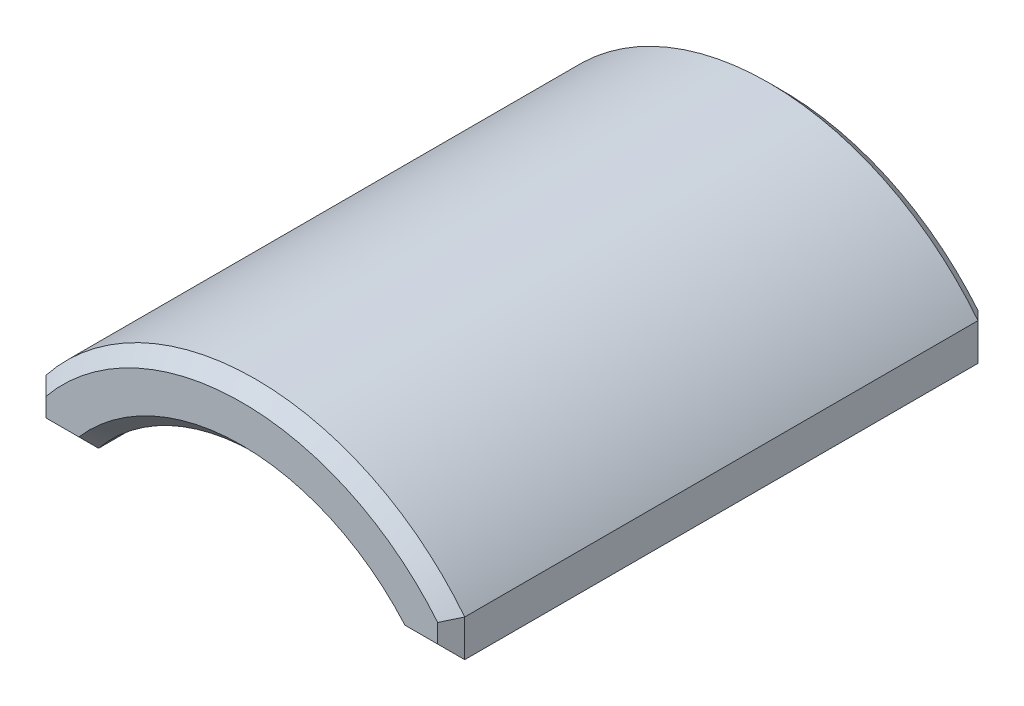
ISO-10303-21;
HEADER;
FILE_DESCRIPTION(('STEP AP214'),'2;1');
FILE_NAME('part.step','',(''),(''),'','','');
FILE_SCHEMA(('AUTOMOTIVE_DESIGN { 1 0 10303 214 1 1 1 1 }'));
ENDSEC;
DATA;
#1=APPLICATION_CONTEXT('core data for automotive mechanical design processes');
#2=APPLICATION_PROTOCOL_DEFINITION('international standard','automotive_design',2000,#1);
#3=PRODUCT_CONTEXT('',#1,'mechanical');
#4=PRODUCT('Part','Part','',(#3));
#5=PRODUCT_RELATED_PRODUCT_CATEGORY('part','',(#4));
#6=PRODUCT_DEFINITION_FORMATION('','',#4);
#7=PRODUCT_DEFINITION_CONTEXT('part definition',#1,'design');
#8=PRODUCT_DEFINITION('design','',#6,#7);
#9=PRODUCT_DEFINITION_SHAPE('','',#8);
#10=(LENGTH_UNIT() NAMED_UNIT(*) SI_UNIT(.MILLI.,.METRE.));
#11=(NAMED_UNIT(*) PLANE_ANGLE_UNIT() SI_UNIT($,.RADIAN.));
#12=(NAMED_UNIT(*) SI_UNIT($,.STERADIAN.) SOLID_ANGLE_UNIT());
#13=UNCERTAINTY_MEASURE_WITH_UNIT(LENGTH_MEASURE(1.E-05),#10,'distance_accuracy_value','');
#14=(GEOMETRIC_REPRESENTATION_CONTEXT(3) GLOBAL_UNCERTAINTY_ASSIGNED_CONTEXT((#13)) GLOBAL_UNIT_ASSIGNED_CONTEXT((#10,
#11,#12)) REPRESENTATION_CONTEXT('',''));
#15=CARTESIAN_POINT('',(0.,0.,0.));
#16=DIRECTION('',(0.,0.,1.));
#17=DIRECTION('',(1.,0.,0.));
#18=AXIS2_PLACEMENT_3D('',#15,#16,#17);
#19=CARTESIAN_POINT('',(0.,0.,40.));
#20=DIRECTION('',(0.,0.,-1.));
#21=DIRECTION('',(-0.999999999999999,0.,0.));
#22=AXIS2_PLACEMENT_3D('',#19,#20,#21);
#23=CYLINDRICAL_SURFACE('',#22,19.75);
#24=DIRECTION('',(0.,0.,-1.));
#25=VECTOR('',#24,1.);
#26=CARTESIAN_POINT('',(15.5,12.2397916648935,40.0000000000001));
#27=LINE('',#26,#25);
#28=CARTESIAN_POINT('',(15.5,12.2397916648935,39.0000000000001));
#29=VERTEX_POINT('',#28);
#30=CARTESIAN_POINT('',(15.5,12.2397916648936,1.00000000000008));
#31=VERTEX_POINT('',#30);
#32=EDGE_CURVE('E323',#29,#31,#27,.T.);
#33=ORIENTED_EDGE('',*,*,#32,.T.);
#34=CARTESIAN_POINT('',(0.,0.,1.));
#35=DIRECTION('',(0.,0.,1.));
#36=DIRECTION('',(0.999999999999999,0.,0.));
#37=AXIS2_PLACEMENT_3D('',#34,#35,#36);
#38=CIRCLE('',#37,19.75);
#39=CARTESIAN_POINT('',(-15.5,12.2397916648937,1.));
#40=VERTEX_POINT('',#39);
#41=EDGE_CURVE('E191',#31,#40,#38,.T.);
#42=ORIENTED_EDGE('',*,*,#41,.T.);
#43=DIRECTION('',(0.,0.,-1.));
#44=VECTOR('',#43,1.);
#45=CARTESIAN_POINT('',(-15.5,12.2397916648936,40.));
#46=LINE('',#45,#44);
#47=CARTESIAN_POINT('',(-15.5,12.2397916648936,39.));
#48=VERTEX_POINT('',#47);
#49=EDGE_CURVE('E142',#48,#40,#46,.T.);
#50=ORIENTED_EDGE('',*,*,#49,.F.);
#51=CARTESIAN_POINT('',(0.,0.,39.));
#52=DIRECTION('',(0.,0.,1.));
#53=DIRECTION('',(0.999999999999999,0.,0.));
#54=AXIS2_PLACEMENT_3D('',#51,#52,#53);
#55=CIRCLE('',#54,19.75);
#56=EDGE_CURVE('E189',#48,#29,#55,.F.);
#57=ORIENTED_EDGE('',*,*,#56,.T.);
#58=EDGE_LOOP('',(#33,#42,#50,#57));
#59=FACE_BOUND('',#58,.T.);
#60=ADVANCED_FACE('F33',(#59),#23,.T.);
#61=CARTESIAN_POINT('',(-15.5,12.2397916648936,40.));
#62=DIRECTION('',(0.999999999999999,0.,0.));
#63=DIRECTION('',(0.,0.,-1.));
#64=AXIS2_PLACEMENT_3D('',#61,#62,#63);
#65=PLANE('',#64);
#66=ORIENTED_EDGE('',*,*,#49,.T.);
#67=DIRECTION('',(0.,-1.,0.));
#68=VECTOR('',#67,1.);
#69=CARTESIAN_POINT('',(-15.5,12.2397916648937,1.));
#70=LINE('',#69,#68);
#71=CARTESIAN_POINT('',(-15.5,9.50000000000003,0.999999999999918));
#72=VERTEX_POINT('',#71);
#73=EDGE_CURVE('E141',#40,#72,#70,.T.);
#74=ORIENTED_EDGE('',*,*,#73,.T.);
#75=DIRECTION('',(0.,0.,-1.));
#76=VECTOR('',#75,1.);
#77=CARTESIAN_POINT('',(-15.5,9.49999999999994,40.));
#78=LINE('',#77,#76);
#79=CARTESIAN_POINT('',(-15.5,9.49999999999996,39.));
#80=VERTEX_POINT('',#79);
#81=EDGE_CURVE('E123',#80,#72,#78,.T.);
#82=ORIENTED_EDGE('',*,*,#81,.F.);
#83=DIRECTION('',(0.,1.,0.));
#84=VECTOR('',#83,1.);
#85=CARTESIAN_POINT('',(-15.5,12.2397916648936,39.));
#86=LINE('',#85,#84);
#87=EDGE_CURVE('E138',#80,#48,#86,.T.);
#88=ORIENTED_EDGE('',*,*,#87,.T.);
#89=EDGE_LOOP('',(#66,#74,#82,#88));
#90=FACE_BOUND('',#89,.T.);
#91=ADVANCED_FACE('F136',(#90),#65,.F.);
#92=CARTESIAN_POINT('',(-15.5,9.49999999999994,40.));
#93=DIRECTION('',(0.,1.,0.));
#94=DIRECTION('',(0.,0.,1.));
#95=AXIS2_PLACEMENT_3D('',#92,#93,#94);
#96=PLANE('',#95);
#97=ORIENTED_EDGE('',*,*,#81,.T.);
#98=DIRECTION('',(0.999999999999999,0.,0.));
#99=VECTOR('',#98,1.);
#100=CARTESIAN_POINT('',(-15.5,9.50000000000003,0.999999999999918));
#101=LINE('',#100,#99);
#102=CARTESIAN_POINT('',(-11.6081867662439,9.50000000000001,0.999999999999918));
#103=VERTEX_POINT('',#102);
#104=EDGE_CURVE('E130',#72,#103,#101,.T.);
#105=ORIENTED_EDGE('',*,*,#104,.T.);
#106=DIRECTION('',(0.,0.,-1.));
#107=VECTOR('',#106,1.);
#108=CARTESIAN_POINT('',(-11.6081867662439,9.49999999999994,40.));
#109=LINE('',#108,#107);
#110=CARTESIAN_POINT('',(-11.6081867662439,9.49999999999994,39.));
#111=VERTEX_POINT('',#110);
#112=EDGE_CURVE('E125',#111,#103,#109,.T.);
#113=ORIENTED_EDGE('',*,*,#112,.F.);
#114=DIRECTION('',(-0.999999999999999,0.,0.));
#115=VECTOR('',#114,1.);
#116=CARTESIAN_POINT('',(-15.5,9.49999999999996,39.));
#117=LINE('',#116,#115);
#118=EDGE_CURVE('E120',#111,#80,#117,.T.);
#119=ORIENTED_EDGE('',*,*,#118,.T.);
#120=EDGE_LOOP('',(#97,#105,#113,#119));
#121=FACE_BOUND('',#120,.T.);
#122=ADVANCED_FACE('F122',(#121),#96,.F.);
#123=CARTESIAN_POINT('',(0.,0.,40.));
#124=DIRECTION('',(0.,0.,-1.));
#125=DIRECTION('',(-0.999999999999999,0.,0.));
#126=AXIS2_PLACEMENT_3D('',#123,#124,#125);
#127=CYLINDRICAL_SURFACE('',#126,15.);
#128=ORIENTED_EDGE('',*,*,#112,.T.);
#129=CARTESIAN_POINT('',(0.,0.,1.));
#130=DIRECTION('',(0.,0.,1.));
#131=DIRECTION('',(0.999999999999999,0.,0.));
#132=AXIS2_PLACEMENT_3D('',#129,#130,#131);
#133=CIRCLE('',#132,15.);
#134=CARTESIAN_POINT('',(11.6081867662439,9.49999999999997,1.));
#135=VERTEX_POINT('',#134);
#136=EDGE_CURVE('E178',#103,#135,#133,.F.);
#137=ORIENTED_EDGE('',*,*,#136,.T.);
#138=DIRECTION('',(0.,0.,-1.));
#139=VECTOR('',#138,1.);
#140=CARTESIAN_POINT('',(11.6081867662439,9.49999999999988,40.));
#141=LINE('',#140,#139);
#142=CARTESIAN_POINT('',(11.6081867662439,9.49999999999988,39.));
#143=VERTEX_POINT('',#142);
#144=EDGE_CURVE('E345',#143,#135,#141,.T.);
#145=ORIENTED_EDGE('',*,*,#144,.F.);
#146=CARTESIAN_POINT('',(0.,0.,39.));
#147=DIRECTION('',(0.,0.,1.));
#148=DIRECTION('',(0.999999999999999,0.,0.));
#149=AXIS2_PLACEMENT_3D('',#146,#147,#148);
#150=CIRCLE('',#149,15.);
#151=EDGE_CURVE('E176',#143,#111,#150,.T.);
#152=ORIENTED_EDGE('',*,*,#151,.T.);
#153=EDGE_LOOP('',(#128,#137,#145,#152));
#154=FACE_BOUND('',#153,.T.);
#155=ADVANCED_FACE('F308',(#154),#127,.F.);
#156=CARTESIAN_POINT('',(11.6081867662439,9.49999999999988,40.));
#157=DIRECTION('',(0.,1.,0.));
#158=DIRECTION('',(0.,0.,1.));
#159=AXIS2_PLACEMENT_3D('',#156,#157,#158);
#160=PLANE('',#159);
#161=ORIENTED_EDGE('',*,*,#144,.T.);
#162=DIRECTION('',(0.999999999999999,0.,0.));
#163=VECTOR('',#162,1.);
#164=CARTESIAN_POINT('',(11.6081867662439,9.49999999999997,1.));
#165=LINE('',#164,#163);
#166=CARTESIAN_POINT('',(15.5,9.49999999999995,1.));
#167=VERTEX_POINT('',#166);
#168=EDGE_CURVE('E182',#135,#167,#165,.T.);
#169=ORIENTED_EDGE('',*,*,#168,.T.);
#170=DIRECTION('',(0.,0.,-1.));
#171=VECTOR('',#170,1.);
#172=CARTESIAN_POINT('',(15.5,9.49999999999988,40.0000000000001));
#173=LINE('',#172,#171);
#174=CARTESIAN_POINT('',(15.5,9.49999999999988,39.0000000000001));
#175=VERTEX_POINT('',#174);
#176=EDGE_CURVE('E326',#175,#167,#173,.T.);
#177=ORIENTED_EDGE('',*,*,#176,.F.);
#178=DIRECTION('',(-0.999999999999999,0.,0.));
#179=VECTOR('',#178,1.);
#180=CARTESIAN_POINT('',(11.6081867662439,9.49999999999988,39.));
#181=LINE('',#180,#179);
#182=EDGE_CURVE('E180',#175,#143,#181,.T.);
#183=ORIENTED_EDGE('',*,*,#182,.T.);
#184=EDGE_LOOP('',(#161,#169,#177,#183));
#185=FACE_BOUND('',#184,.T.);
#186=ADVANCED_FACE('F304',(#185),#160,.F.);
#187=CARTESIAN_POINT('',(15.5,12.2397916648935,40.0000000000001));
#188=DIRECTION('',(-0.999999999999999,0.,0.));
#189=DIRECTION('',(0.,-1.,0.));
#190=AXIS2_PLACEMENT_3D('',#187,#188,#189);
#191=PLANE('',#190);
#192=ORIENTED_EDGE('',*,*,#176,.T.);
#193=DIRECTION('',(0.,1.,0.));
#194=VECTOR('',#193,1.);
#195=CARTESIAN_POINT('',(15.5,12.2397916648936,1.00000000000008));
#196=LINE('',#195,#194);
#197=EDGE_CURVE('E187',#167,#31,#196,.T.);
#198=ORIENTED_EDGE('',*,*,#197,.T.);
#199=ORIENTED_EDGE('',*,*,#32,.F.);
#200=DIRECTION('',(0.,-1.,0.));
#201=VECTOR('',#200,1.);
#202=CARTESIAN_POINT('',(15.5,9.49999999999988,39.0000000000001));
#203=LINE('',#202,#201);
#204=EDGE_CURVE('E184',#29,#175,#203,.T.);
#205=ORIENTED_EDGE('',*,*,#204,.T.);
#206=EDGE_LOOP('',(#192,#198,#199,#205));
#207=FACE_BOUND('',#206,.T.);
#208=ADVANCED_FACE('F301',(#207),#191,.F.);
#209=CARTESIAN_POINT('',(0.,0.,40.));
#210=DIRECTION('',(0.,0.,1.));
#211=DIRECTION('',(0.999999999999999,0.,0.));
#212=AXIS2_PLACEMENT_3D('',#209,#210,#211);
#213=PLANE('',#212);
#214=DIRECTION('',(0.999999999999999,0.,0.));
#215=VECTOR('',#214,1.);
#216=CARTESIAN_POINT('',(15.5,10.4999999999999,40.0000000000001));
#217=LINE('',#216,#215);
#218=CARTESIAN_POINT('',(12.0726964676497,10.4999999999999,40.0000000000001));
#219=VERTEX_POINT('',#218);
#220=CARTESIAN_POINT('',(14.5,10.4999999999999,40.0000000000001));
#221=VERTEX_POINT('',#220);
#222=EDGE_CURVE('E40',#219,#221,#217,.T.);
#223=ORIENTED_EDGE('',*,*,#222,.T.);
#224=DIRECTION('',(0.,1.,0.));
#225=VECTOR('',#224,1.);
#226=CARTESIAN_POINT('',(14.5,12.2397916648935,40.0000000000001));
#227=LINE('',#226,#225);
#228=CARTESIAN_POINT('',(14.5,11.8874934279686,40.0000000000001));
#229=VERTEX_POINT('',#228);
#230=EDGE_CURVE('E11',#221,#229,#227,.T.);
#231=ORIENTED_EDGE('',*,*,#230,.T.);
#232=CARTESIAN_POINT('',(0.,0.,40.));
#233=DIRECTION('',(0.,0.,1.));
#234=DIRECTION('',(0.999999999999999,0.,0.));
#235=AXIS2_PLACEMENT_3D('',#232,#233,#234);
#236=CIRCLE('',#235,18.75);
#237=CARTESIAN_POINT('',(-14.5,11.8874934279687,40.));
#238=VERTEX_POINT('',#237);
#239=EDGE_CURVE('E193',#229,#238,#236,.T.);
#240=ORIENTED_EDGE('',*,*,#239,.T.);
#241=DIRECTION('',(0.,-1.,0.));
#242=VECTOR('',#241,1.);
#243=CARTESIAN_POINT('',(-14.5,9.49999999999994,40.));
#244=LINE('',#243,#242);
#245=CARTESIAN_POINT('',(-14.5,10.4999999999999,40.));
#246=VERTEX_POINT('',#245);
#247=EDGE_CURVE('E195',#238,#246,#244,.T.);
#248=ORIENTED_EDGE('',*,*,#247,.T.);
#249=DIRECTION('',(0.999999999999999,0.,0.));
#250=VECTOR('',#249,1.);
#251=CARTESIAN_POINT('',(-11.6081867662439,10.4999999999999,40.));
#252=LINE('',#251,#250);
#253=CARTESIAN_POINT('',(-12.0726964676496,10.4999999999999,40.));
#254=VERTEX_POINT('',#253);
#255=EDGE_CURVE('E148',#246,#254,#252,.T.);
#256=ORIENTED_EDGE('',*,*,#255,.T.);
#257=CARTESIAN_POINT('',(0.,0.,40.));
#258=DIRECTION('',(0.,0.,1.));
#259=DIRECTION('',(0.999999999999999,0.,0.));
#260=AXIS2_PLACEMENT_3D('',#257,#258,#259);
#261=CIRCLE('',#260,16.);
#262=EDGE_CURVE('E50',#254,#219,#261,.F.);
#263=ORIENTED_EDGE('',*,*,#262,.T.);
#264=EDGE_LOOP('',(#223,#231,#240,#248,#256,#263));
#265=FACE_BOUND('',#264,.T.);
#266=ADVANCED_FACE('F198',(#265),#213,.T.);
#267=CARTESIAN_POINT('',(0.,0.,0.));
#268=DIRECTION('',(0.,0.,1.));
#269=DIRECTION('',(0.999999999999999,0.,0.));
#270=AXIS2_PLACEMENT_3D('',#267,#268,#269);
#271=PLANE('',#270);
#272=DIRECTION('',(-0.999999999999999,0.,0.));
#273=VECTOR('',#272,1.);
#274=CARTESIAN_POINT('',(0.,10.5,0.));
#275=LINE('',#274,#273);
#276=CARTESIAN_POINT('',(-12.0726964676497,10.5,0.));
#277=VERTEX_POINT('',#276);
#278=CARTESIAN_POINT('',(-14.5,10.5,0.));
#279=VERTEX_POINT('',#278);
#280=EDGE_CURVE('E171',#277,#279,#275,.T.);
#281=ORIENTED_EDGE('',*,*,#280,.T.);
#282=DIRECTION('',(0.,1.,0.));
#283=VECTOR('',#282,1.);
#284=CARTESIAN_POINT('',(-14.5,0.,0.));
#285=LINE('',#284,#283);
#286=CARTESIAN_POINT('',(-14.5,11.8874934279688,0.));
#287=VERTEX_POINT('',#286);
#288=EDGE_CURVE('E131',#279,#287,#285,.T.);
#289=ORIENTED_EDGE('',*,*,#288,.T.);
#290=CARTESIAN_POINT('',(0.,0.,0.));
#291=DIRECTION('',(0.,0.,1.));
#292=DIRECTION('',(0.999999999999999,0.,0.));
#293=AXIS2_PLACEMENT_3D('',#290,#291,#292);
#294=CIRCLE('',#293,18.75);
#295=CARTESIAN_POINT('',(14.4999999999999,11.8874934279687,0.));
#296=VERTEX_POINT('',#295);
#297=EDGE_CURVE('E160',#287,#296,#294,.F.);
#298=ORIENTED_EDGE('',*,*,#297,.T.);
#299=DIRECTION('',(0.,-1.,0.));
#300=VECTOR('',#299,1.);
#301=CARTESIAN_POINT('',(14.5,0.,0.));
#302=LINE('',#301,#300);
#303=CARTESIAN_POINT('',(14.5,10.5,0.));
#304=VERTEX_POINT('',#303);
#305=EDGE_CURVE('E165',#296,#304,#302,.T.);
#306=ORIENTED_EDGE('',*,*,#305,.T.);
#307=DIRECTION('',(-0.999999999999999,0.,0.));
#308=VECTOR('',#307,1.);
#309=CARTESIAN_POINT('',(0.,10.5,0.));
#310=LINE('',#309,#308);
#311=CARTESIAN_POINT('',(12.0726964676496,10.5,0.));
#312=VERTEX_POINT('',#311);
#313=EDGE_CURVE('E167',#304,#312,#310,.T.);
#314=ORIENTED_EDGE('',*,*,#313,.T.);
#315=CARTESIAN_POINT('',(0.,0.,0.));
#316=DIRECTION('',(0.,0.,1.));
#317=DIRECTION('',(0.999999999999999,0.,0.));
#318=AXIS2_PLACEMENT_3D('',#315,#316,#317);
#319=CIRCLE('',#318,16.);
#320=EDGE_CURVE('E169',#312,#277,#319,.T.);
#321=ORIENTED_EDGE('',*,*,#320,.T.);
#322=EDGE_LOOP('',(#281,#289,#298,#306,#314,#321));
#323=FACE_BOUND('',#322,.T.);
#324=ADVANCED_FACE('F294',(#323),#271,.F.);
#325=CARTESIAN_POINT('',(11.6081867662439,9.49999999999997,1.));
#326=DIRECTION('',(0.,0.707106781186544,0.707106781186547));
#327=DIRECTION('',(0.,-0.707106781186551,0.707106781186549));
#328=AXIS2_PLACEMENT_3D('',#325,#326,#327);
#329=PLANE('',#328);
#330=CARTESIAN_POINT('',(11.6081867662439,9.49999999999997,1.));
#331=CARTESIAN_POINT('',(11.6869756748738,9.66634838270949,0.833651617290471));
#332=CARTESIAN_POINT('',(11.7650792813433,9.83285593016955,0.667144069830415));
#333=CARTESIAN_POINT('',(11.9199158477309,10.1661892636765,0.33381073632347));
#334=CARTESIAN_POINT('',(11.9966488083967,10.3330150495498,0.166984950450224));
#335=CARTESIAN_POINT('',(12.0726964676497,10.5,0.));
#336=B_SPLINE_CURVE_WITH_KNOTS('',3,(#330,#331,#332,#333,#334,#335),.UNSPECIFIED.,.F.,.F.,(4,2,
4),(0.,0.744276360361412,1.48855231473112),.UNSPECIFIED.);
#337=EDGE_CURVE('E274',#312,#135,#336,.F.);
#338=ORIENTED_EDGE('',*,*,#337,.F.);
#339=ORIENTED_EDGE('',*,*,#313,.F.);
#340=DIRECTION('',(-0.577350269189628,0.577350269189629,-0.577350269189626));
#341=VECTOR('',#340,1.);
#342=CARTESIAN_POINT('',(14.5867361117021,10.4132638882979,0.0867361117021098));
#343=LINE('',#342,#341);
#344=EDGE_CURVE('E327',#167,#304,#343,.T.);
#345=ORIENTED_EDGE('',*,*,#344,.F.);
#346=ORIENTED_EDGE('',*,*,#168,.F.);
#347=EDGE_LOOP('',(#338,#339,#345,#346));
#348=FACE_BOUND('',#347,.T.);
#349=ADVANCED_FACE('F288',(#348),#329,.F.);
#350=CARTESIAN_POINT('',(15.5,12.2397916648936,1.00000000000008));
#351=DIRECTION('',(-0.707106781186545,0.,0.707106781186549));
#352=DIRECTION('',(0.707106781186548,0.,0.707106781186548));
#353=AXIS2_PLACEMENT_3D('',#350,#351,#352);
#354=PLANE('',#353);
#355=ORIENTED_EDGE('',*,*,#344,.T.);
#356=ORIENTED_EDGE('',*,*,#305,.F.);
#357=CARTESIAN_POINT('',(15.5,12.2397916648936,1.00000000000008));
#358=CARTESIAN_POINT('',(15.3331911546325,12.1818825182728,0.833191154632603));
#359=CARTESIAN_POINT('',(15.1664534049574,12.1235697608189,0.666453404957532));
#360=CARTESIAN_POINT('',(14.8331200716024,12.0061370153003,0.333120071602537));
#361=CARTESIAN_POINT('',(14.6665244879441,11.9470170271125,0.166524487944275));
#362=CARTESIAN_POINT('',(14.4999999999999,11.8874934279687,0.));
#363=B_SPLINE_CURVE_WITH_KNOTS('',3,(#357,#358,#359,#360,#361,#362),.UNSPECIFIED.,.F.,.F.,(4,2,
4),(0.,0.728718044333748,1.45743619967897),.UNSPECIFIED.);
#364=EDGE_CURVE('E267',#31,#296,#363,.T.);
#365=ORIENTED_EDGE('',*,*,#364,.F.);
#366=ORIENTED_EDGE('',*,*,#197,.F.);
#367=EDGE_LOOP('',(#355,#356,#365,#366));
#368=FACE_BOUND('',#367,.T.);
#369=ADVANCED_FACE('F285',(#368),#354,.F.);
#370=CARTESIAN_POINT('',(0.,0.,1.));
#371=DIRECTION('',(0.,0.,-1.));
#372=DIRECTION('',(-0.999999999999999,0.,0.));
#373=AXIS2_PLACEMENT_3D('',#370,#371,#372);
#374=CONICAL_SURFACE('',#373,15.,0.78539816339745);
#375=ORIENTED_EDGE('',*,*,#337,.T.);
#376=ORIENTED_EDGE('',*,*,#136,.F.);
#377=CARTESIAN_POINT('',(-11.6081867662439,9.50000000000001,0.999999999999918));
#378=CARTESIAN_POINT('',(-11.6869756748739,9.66634838270955,0.833651617290395));
#379=CARTESIAN_POINT('',(-11.7650792813434,9.83285593016961,0.667144069830336));
#380=CARTESIAN_POINT('',(-11.919915847731,10.1661892636766,0.333810736323363));
#381=CARTESIAN_POINT('',(-11.9966488083968,10.3330150495499,0.166984950450093));
#382=CARTESIAN_POINT('',(-12.0726964676497,10.5,0.));
#383=B_SPLINE_CURVE_WITH_KNOTS('',3,(#377,#378,#379,#380,#381,#382),.UNSPECIFIED.,.F.,.F.,(4,2,
4),(0.,0.744276360361453,1.4885523147312),.UNSPECIFIED.);
#384=EDGE_CURVE('E275',#277,#103,#383,.F.);
#385=ORIENTED_EDGE('',*,*,#384,.F.);
#386=ORIENTED_EDGE('',*,*,#320,.F.);
#387=EDGE_LOOP('',(#375,#376,#385,#386));
#388=FACE_BOUND('',#387,.T.);
#389=ADVANCED_FACE('F256',(#388),#374,.F.);
#390=CARTESIAN_POINT('',(0.,0.,1.));
#391=DIRECTION('',(0.,0.,1.));
#392=DIRECTION('',(0.999999999999999,0.,0.));
#393=AXIS2_PLACEMENT_3D('',#390,#391,#392);
#394=CONICAL_SURFACE('',#393,19.75,0.78539816339745);
#395=ORIENTED_EDGE('',*,*,#364,.T.);
#396=ORIENTED_EDGE('',*,*,#297,.F.);
#397=CARTESIAN_POINT('',(-14.5,11.8874934279688,0.));
#398=CARTESIAN_POINT('',(-14.6665244879442,11.9470170271124,0.166524487944232));
#399=CARTESIAN_POINT('',(-14.8331200716025,12.0061370153,0.333120071602515));
#400=CARTESIAN_POINT('',(-15.1664534049575,12.1235697608187,0.666453404957509));
#401=CARTESIAN_POINT('',(-15.3331911546326,12.1818825182727,0.833191154632561));
#402=CARTESIAN_POINT('',(-15.5,12.2397916648937,1.));
#403=B_SPLINE_CURVE_WITH_KNOTS('',3,(#397,#398,#399,#400,#401,#402),.UNSPECIFIED.,.F.,.F.,(4,2,
4),(0.,0.728718155345221,1.45743619967896),.UNSPECIFIED.);
#404=EDGE_CURVE('E261',#40,#287,#403,.F.);
#405=ORIENTED_EDGE('',*,*,#404,.F.);
#406=ORIENTED_EDGE('',*,*,#41,.F.);
#407=EDGE_LOOP('',(#395,#396,#405,#406));
#408=FACE_BOUND('',#407,.T.);
#409=ADVANCED_FACE('F251',(#408),#394,.T.);
#410=CARTESIAN_POINT('',(-15.5,9.50000000000003,0.999999999999918));
#411=DIRECTION('',(0.,0.707106781186544,0.707106781186547));
#412=DIRECTION('',(0.,-0.707106781186551,0.707106781186549));
#413=AXIS2_PLACEMENT_3D('',#410,#411,#412);
#414=PLANE('',#413);
#415=ORIENTED_EDGE('',*,*,#384,.T.);
#416=ORIENTED_EDGE('',*,*,#104,.F.);
#417=DIRECTION('',(0.577350269189623,0.577350269189627,-0.577350269189625));
#418=VECTOR('',#417,1.);
#419=CARTESIAN_POINT('',(-15.5,9.50000000000003,0.999999999999918));
#420=LINE('',#419,#418);
#421=EDGE_CURVE('E201',#279,#72,#420,.F.);
#422=ORIENTED_EDGE('',*,*,#421,.F.);
#423=ORIENTED_EDGE('',*,*,#280,.F.);
#424=EDGE_LOOP('',(#415,#416,#422,#423));
#425=FACE_BOUND('',#424,.T.);
#426=ADVANCED_FACE('F255',(#425),#414,.F.);
#427=CARTESIAN_POINT('',(-15.5,12.2397916648937,1.));
#428=DIRECTION('',(0.707106781186546,0.,0.70710678118655));
#429=DIRECTION('',(0.707106781186547,0.,-0.707106781186546));
#430=AXIS2_PLACEMENT_3D('',#427,#428,#429);
#431=PLANE('',#430);
#432=ORIENTED_EDGE('',*,*,#404,.T.);
#433=ORIENTED_EDGE('',*,*,#288,.F.);
#434=ORIENTED_EDGE('',*,*,#421,.T.);
#435=ORIENTED_EDGE('',*,*,#73,.F.);
#436=EDGE_LOOP('',(#432,#433,#434,#435));
#437=FACE_BOUND('',#436,.T.);
#438=ADVANCED_FACE('F250',(#437),#431,.F.);
#439=CARTESIAN_POINT('',(0.,10.4999999999999,40.));
#440=DIRECTION('',(0.,-0.70710678118655,0.70710678118655));
#441=DIRECTION('',(0.,-0.707106781186545,-0.707106781186546));
#442=AXIS2_PLACEMENT_3D('',#439,#440,#441);
#443=PLANE('',#442);
#444=DIRECTION('',(0.577350269189625,0.577350269189623,0.577350269189626));
#445=VECTOR('',#444,1.);
#446=CARTESIAN_POINT('',(-18.,6.99999999999996,36.5));
#447=LINE('',#446,#445);
#448=EDGE_CURVE('E146',#80,#246,#447,.T.);
#449=ORIENTED_EDGE('',*,*,#448,.F.);
#450=ORIENTED_EDGE('',*,*,#118,.F.);
#451=CARTESIAN_POINT('',(-11.6081867662439,9.49999999999994,39.));
#452=CARTESIAN_POINT('',(-11.6869756748738,9.66634838270946,39.1663483827096));
#453=CARTESIAN_POINT('',(-11.7650792813432,9.83285593016952,39.3328559301697));
#454=CARTESIAN_POINT('',(-11.9199158477309,10.1661892636765,39.6661892636766));
#455=CARTESIAN_POINT('',(-11.9966488083967,10.3330150495498,39.8330150495499));
#456=CARTESIAN_POINT('',(-12.0726964676497,10.4999999999999,40.));
#457=B_SPLINE_CURVE_WITH_KNOTS('',3,(#451,#452,#453,#454,#455,#456),.UNSPECIFIED.,.F.,.F.,(4,2,
4),(0.,0.744276360361435,1.48855231473116),.UNSPECIFIED.);
#458=EDGE_CURVE('E151',#254,#111,#457,.F.);
#459=ORIENTED_EDGE('',*,*,#458,.F.);
#460=ORIENTED_EDGE('',*,*,#255,.F.);
#461=EDGE_LOOP('',(#449,#450,#459,#460));
#462=FACE_BOUND('',#461,.T.);
#463=ADVANCED_FACE('F147',(#462),#443,.T.);
#464=CARTESIAN_POINT('',(0.,0.,40.));
#465=DIRECTION('',(0.,0.,1.));
#466=DIRECTION('',(0.999999999999999,0.,0.));
#467=AXIS2_PLACEMENT_3D('',#464,#465,#466);
#468=CONICAL_SURFACE('',#467,16.,0.785398163397448);
#469=ORIENTED_EDGE('',*,*,#458,.T.);
#470=ORIENTED_EDGE('',*,*,#151,.F.);
#471=CARTESIAN_POINT('',(11.6081867662439,9.49999999999988,39.));
#472=CARTESIAN_POINT('',(11.6869756748738,9.66634838270947,39.1663483827095));
#473=CARTESIAN_POINT('',(11.7650792813433,9.83285593016955,39.3328559301696));
#474=CARTESIAN_POINT('',(11.9199158477309,10.1661892636765,39.6661892636766));
#475=CARTESIAN_POINT('',(11.9966488083967,10.3330150495498,39.8330150495499));
#476=CARTESIAN_POINT('',(12.0726964676497,10.4999999999999,40.0000000000001));
#477=B_SPLINE_CURVE_WITH_KNOTS('',3,(#471,#472,#473,#474,#475,#476),.UNSPECIFIED.,.F.,.F.,(4,2,
4),(0.,0.744276360361481,1.48855231473126),.UNSPECIFIED.);
#478=EDGE_CURVE('E152',#219,#143,#477,.F.);
#479=ORIENTED_EDGE('',*,*,#478,.F.);
#480=ORIENTED_EDGE('',*,*,#262,.F.);
#481=EDGE_LOOP('',(#469,#470,#479,#480));
#482=FACE_BOUND('',#481,.T.);
#483=ADVANCED_FACE('F203',(#482),#468,.F.);
#484=CARTESIAN_POINT('',(-14.4999999999999,0.,40.));
#485=DIRECTION('',(-0.707106781186546,0.,0.707106781186547));
#486=DIRECTION('',(0.707106781186547,0.,0.707106781186549));
#487=AXIS2_PLACEMENT_3D('',#484,#485,#486);
#488=PLANE('',#487);
#489=ORIENTED_EDGE('',*,*,#448,.T.);
#490=ORIENTED_EDGE('',*,*,#247,.F.);
#491=CARTESIAN_POINT('',(-15.5,12.2397916648936,39.));
#492=CARTESIAN_POINT('',(-15.3331911546325,12.1818825182727,39.1668088453674));
#493=CARTESIAN_POINT('',(-15.1664534049574,12.1235697608188,39.3335465950425));
#494=CARTESIAN_POINT('',(-14.8331200716024,12.0061370153001,39.6668799283975));
#495=CARTESIAN_POINT('',(-14.6665244879442,11.9470170271124,39.8334755120558));
#496=CARTESIAN_POINT('',(-14.5,11.8874934279687,40.));
#497=B_SPLINE_CURVE_WITH_KNOTS('',3,(#491,#492,#493,#494,#495,#496),.UNSPECIFIED.,.F.,.F.,(4,2,
4),(0.,0.728718044333757,1.45743619967899),.UNSPECIFIED.);
#498=EDGE_CURVE('E157',#48,#238,#497,.T.);
#499=ORIENTED_EDGE('',*,*,#498,.F.);
#500=ORIENTED_EDGE('',*,*,#87,.F.);
#501=EDGE_LOOP('',(#489,#490,#499,#500));
#502=FACE_BOUND('',#501,.T.);
#503=ADVANCED_FACE('F155',(#502),#488,.T.);
#504=CARTESIAN_POINT('',(0.,10.4999999999999,40.));
#505=DIRECTION('',(0.,-0.70710678118655,0.70710678118655));
#506=DIRECTION('',(0.,-0.707106781186545,-0.707106781186546));
#507=AXIS2_PLACEMENT_3D('',#504,#505,#506);
#508=PLANE('',#507);
#509=ORIENTED_EDGE('',*,*,#478,.T.);
#510=ORIENTED_EDGE('',*,*,#182,.F.);
#511=DIRECTION('',(-0.577350269189624,0.577350269189625,0.577350269189625));
#512=VECTOR('',#511,1.);
#513=CARTESIAN_POINT('',(9.66666666666665,15.3333333333332,44.8333333333332));
#514=LINE('',#513,#512);
#515=EDGE_CURVE('E209',#221,#175,#514,.F.);
#516=ORIENTED_EDGE('',*,*,#515,.F.);
#517=ORIENTED_EDGE('',*,*,#222,.F.);
#518=EDGE_LOOP('',(#509,#510,#516,#517));
#519=FACE_BOUND('',#518,.T.);
#520=ADVANCED_FACE('F208',(#519),#508,.T.);
#521=CARTESIAN_POINT('',(0.,0.,40.));
#522=DIRECTION('',(0.,0.,-1.));
#523=DIRECTION('',(-0.999999999999999,0.,0.));
#524=AXIS2_PLACEMENT_3D('',#521,#522,#523);
#525=CONICAL_SURFACE('',#524,18.75,0.785398163397448);
#526=ORIENTED_EDGE('',*,*,#498,.T.);
#527=ORIENTED_EDGE('',*,*,#239,.F.);
#528=CARTESIAN_POINT('',(14.5,11.8874934279686,40.0000000000001));
#529=CARTESIAN_POINT('',(14.6665244879443,11.9470170271122,39.8334755120559));
#530=CARTESIAN_POINT('',(14.8331200716026,12.0061370152998,39.6668799283976));
#531=CARTESIAN_POINT('',(15.1664534049575,12.1235697608185,39.3335465950426));
#532=CARTESIAN_POINT('',(15.3331911546326,12.1818825182725,39.1668088453676));
#533=CARTESIAN_POINT('',(15.5,12.2397916648935,39.0000000000001));
#534=B_SPLINE_CURVE_WITH_KNOTS('',3,(#528,#529,#530,#531,#532,#533),.UNSPECIFIED.,.F.,.F.,(4,2,
4),(0.,0.728718155345223,1.45743619967897),.UNSPECIFIED.);
#535=EDGE_CURVE('E213',#29,#229,#534,.F.);
#536=ORIENTED_EDGE('',*,*,#535,.F.);
#537=ORIENTED_EDGE('',*,*,#56,.F.);
#538=EDGE_LOOP('',(#526,#527,#536,#537));
#539=FACE_BOUND('',#538,.T.);
#540=ADVANCED_FACE('F219',(#539),#525,.T.);
#541=CARTESIAN_POINT('',(14.5,-1.11609892974531E-13,40.0000000000001));
#542=DIRECTION('',(0.707106781186548,0.,0.707106781186549));
#543=DIRECTION('',(0.707106781186546,0.,-0.707106781186548));
#544=AXIS2_PLACEMENT_3D('',#541,#542,#543);
#545=PLANE('',#544);
#546=ORIENTED_EDGE('',*,*,#515,.T.);
#547=ORIENTED_EDGE('',*,*,#204,.F.);
#548=ORIENTED_EDGE('',*,*,#535,.T.);
#549=ORIENTED_EDGE('',*,*,#230,.F.);
#550=EDGE_LOOP('',(#546,#547,#548,#549));
#551=FACE_BOUND('',#550,.T.);
#552=ADVANCED_FACE('F215',(#551),#545,.T.);
#553=CLOSED_SHELL('',(#60,#91,#122,#155,#186,#208,#266,#324,#349,#369,#389,#409,#426,#438,#463,
#483,#503,#520,#540,#552));
#554=MANIFOLD_SOLID_BREP('B2',#553);
#555=ADVANCED_BREP_SHAPE_REPRESENTATION('',(#18,#554),#14);
#556=SHAPE_DEFINITION_REPRESENTATION(#9,#555);
ENDSEC;
END-ISO-10303-21;
